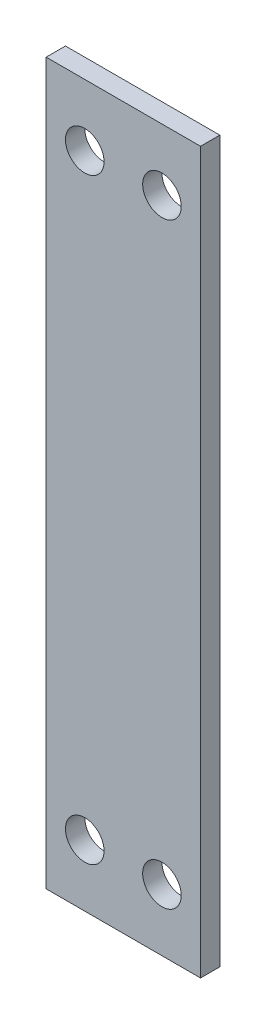
ISO-10303-21;
HEADER;
FILE_DESCRIPTION(('STEP AP214'),'2;1');
FILE_NAME('part.step','',(''),(''),'','','');
FILE_SCHEMA(('AUTOMOTIVE_DESIGN { 1 0 10303 214 1 1 1 1 }'));
ENDSEC;
DATA;
#1=APPLICATION_CONTEXT('core data for automotive mechanical design processes');
#2=APPLICATION_PROTOCOL_DEFINITION('international standard','automotive_design',2000,#1);
#3=PRODUCT_CONTEXT('',#1,'mechanical');
#4=PRODUCT('Part','Part','',(#3));
#5=PRODUCT_RELATED_PRODUCT_CATEGORY('part','',(#4));
#6=PRODUCT_DEFINITION_FORMATION('','',#4);
#7=PRODUCT_DEFINITION_CONTEXT('part definition',#1,'design');
#8=PRODUCT_DEFINITION('design','',#6,#7);
#9=PRODUCT_DEFINITION_SHAPE('','',#8);
#10=(LENGTH_UNIT() NAMED_UNIT(*) SI_UNIT(.MILLI.,.METRE.));
#11=(NAMED_UNIT(*) PLANE_ANGLE_UNIT() SI_UNIT($,.RADIAN.));
#12=(NAMED_UNIT(*) SI_UNIT($,.STERADIAN.) SOLID_ANGLE_UNIT());
#13=UNCERTAINTY_MEASURE_WITH_UNIT(LENGTH_MEASURE(1.E-05),#10,'distance_accuracy_value','');
#14=(GEOMETRIC_REPRESENTATION_CONTEXT(3) GLOBAL_UNCERTAINTY_ASSIGNED_CONTEXT((#13)) GLOBAL_UNIT_ASSIGNED_CONTEXT((#10,
#11,#12)) REPRESENTATION_CONTEXT('',''));
#15=CARTESIAN_POINT('',(0.,0.,0.));
#16=DIRECTION('',(0.,0.,1.));
#17=DIRECTION('',(1.,0.,0.));
#18=AXIS2_PLACEMENT_3D('',#15,#16,#17);
#19=CARTESIAN_POINT('',(0.,0.,4.7625));
#20=DIRECTION('',(0.,0.,-1.));
#21=DIRECTION('',(-1.,0.,0.));
#22=AXIS2_PLACEMENT_3D('',#19,#20,#21);
#23=PLANE('',#22);
#24=DIRECTION('',(0.,-1.,0.));
#25=VECTOR('',#24,1.);
#26=CARTESIAN_POINT('',(0.,0.,4.7625));
#27=LINE('',#26,#25);
#28=CARTESIAN_POINT('',(0.,177.8,4.7625));
#29=VERTEX_POINT('',#28);
#30=CARTESIAN_POINT('',(0.,0.,4.7625));
#31=VERTEX_POINT('',#30);
#32=EDGE_CURVE('E96',#29,#31,#27,.T.);
#33=ORIENTED_EDGE('',*,*,#32,.T.);
#34=DIRECTION('',(1.,0.,0.));
#35=VECTOR('',#34,1.);
#36=CARTESIAN_POINT('',(0.,0.,4.7625));
#37=LINE('',#36,#35);
#38=CARTESIAN_POINT('',(38.1,0.,4.7625));
#39=VERTEX_POINT('',#38);
#40=EDGE_CURVE('E91',#31,#39,#37,.T.);
#41=ORIENTED_EDGE('',*,*,#40,.T.);
#42=DIRECTION('',(0.,1.,0.));
#43=VECTOR('',#42,1.);
#44=CARTESIAN_POINT('',(38.1,0.,4.7625));
#45=LINE('',#44,#43);
#46=CARTESIAN_POINT('',(38.1,177.8,4.7625));
#47=VERTEX_POINT('',#46);
#48=EDGE_CURVE('E94',#39,#47,#45,.T.);
#49=ORIENTED_EDGE('',*,*,#48,.T.);
#50=DIRECTION('',(-1.,0.,0.));
#51=VECTOR('',#50,1.);
#52=CARTESIAN_POINT('',(0.,177.8,4.7625));
#53=LINE('',#52,#51);
#54=EDGE_CURVE('E61',#47,#29,#53,.T.);
#55=ORIENTED_EDGE('',*,*,#54,.T.);
#56=EDGE_LOOP('',(#33,#41,#49,#55));
#57=FACE_BOUND('',#56,.T.);
#58=CARTESIAN_POINT('',(9.525,15.24,4.7625));
#59=DIRECTION('',(0.,0.,1.));
#60=DIRECTION('',(1.,0.,0.));
#61=AXIS2_PLACEMENT_3D('',#58,#59,#60);
#62=CIRCLE('',#61,4.7625);
#63=CARTESIAN_POINT('',(4.7625,15.24,4.7625));
#64=VERTEX_POINT('',#63);
#65=EDGE_CURVE('E116',#64,#64,#62,.T.);
#66=ORIENTED_EDGE('',*,*,#65,.F.);
#67=EDGE_LOOP('',(#66));
#68=FACE_BOUND('',#67,.T.);
#69=CARTESIAN_POINT('',(28.575,15.24,4.7625));
#70=DIRECTION('',(0.,0.,1.));
#71=DIRECTION('',(1.,0.,0.));
#72=AXIS2_PLACEMENT_3D('',#69,#70,#71);
#73=CIRCLE('',#72,4.7625);
#74=CARTESIAN_POINT('',(23.8125,15.24,4.7625));
#75=VERTEX_POINT('',#74);
#76=EDGE_CURVE('E138',#75,#75,#73,.T.);
#77=ORIENTED_EDGE('',*,*,#76,.F.);
#78=EDGE_LOOP('',(#77));
#79=FACE_BOUND('',#78,.T.);
#80=CARTESIAN_POINT('',(9.525,162.56,4.7625));
#81=DIRECTION('',(0.,0.,1.));
#82=DIRECTION('',(1.,0.,0.));
#83=AXIS2_PLACEMENT_3D('',#80,#81,#82);
#84=CIRCLE('',#83,4.7625);
#85=CARTESIAN_POINT('',(4.76250000000001,162.56,4.7625));
#86=VERTEX_POINT('',#85);
#87=EDGE_CURVE('E146',#86,#86,#84,.T.);
#88=ORIENTED_EDGE('',*,*,#87,.F.);
#89=EDGE_LOOP('',(#88));
#90=FACE_BOUND('',#89,.T.);
#91=CARTESIAN_POINT('',(28.575,162.56,4.7625));
#92=DIRECTION('',(0.,0.,1.));
#93=DIRECTION('',(1.,0.,0.));
#94=AXIS2_PLACEMENT_3D('',#91,#92,#93);
#95=CIRCLE('',#94,4.7625);
#96=CARTESIAN_POINT('',(23.8125,162.56,4.7625));
#97=VERTEX_POINT('',#96);
#98=EDGE_CURVE('E154',#97,#97,#95,.T.);
#99=ORIENTED_EDGE('',*,*,#98,.F.);
#100=EDGE_LOOP('',(#99));
#101=FACE_BOUND('',#100,.T.);
#102=ADVANCED_FACE('F43',(#57,#68,#79,#90,#101),#23,.F.);
#103=CARTESIAN_POINT('',(0.,0.,0.));
#104=DIRECTION('',(0.,0.,-1.));
#105=DIRECTION('',(-1.,0.,0.));
#106=AXIS2_PLACEMENT_3D('',#103,#104,#105);
#107=PLANE('',#106);
#108=CARTESIAN_POINT('',(9.525,162.56,0.));
#109=DIRECTION('',(0.,0.,1.));
#110=DIRECTION('',(1.,0.,0.));
#111=AXIS2_PLACEMENT_3D('',#108,#109,#110);
#112=CIRCLE('',#111,4.7625);
#113=CARTESIAN_POINT('',(4.76250000000001,162.56,0.));
#114=VERTEX_POINT('',#113);
#115=EDGE_CURVE('E150',#114,#114,#112,.T.);
#116=ORIENTED_EDGE('',*,*,#115,.T.);
#117=EDGE_LOOP('',(#116));
#118=FACE_BOUND('',#117,.T.);
#119=CARTESIAN_POINT('',(9.525,15.24,0.));
#120=DIRECTION('',(0.,0.,1.));
#121=DIRECTION('',(1.,0.,0.));
#122=AXIS2_PLACEMENT_3D('',#119,#120,#121);
#123=CIRCLE('',#122,4.7625);
#124=CARTESIAN_POINT('',(4.7625,15.24,0.));
#125=VERTEX_POINT('',#124);
#126=EDGE_CURVE('E134',#125,#125,#123,.T.);
#127=ORIENTED_EDGE('',*,*,#126,.T.);
#128=EDGE_LOOP('',(#127));
#129=FACE_BOUND('',#128,.T.);
#130=DIRECTION('',(0.,-1.,0.));
#131=VECTOR('',#130,1.);
#132=CARTESIAN_POINT('',(0.,0.,0.));
#133=LINE('',#132,#131);
#134=CARTESIAN_POINT('',(0.,177.8,0.));
#135=VERTEX_POINT('',#134);
#136=CARTESIAN_POINT('',(0.,0.,0.));
#137=VERTEX_POINT('',#136);
#138=EDGE_CURVE('E112',#135,#137,#133,.T.);
#139=ORIENTED_EDGE('',*,*,#138,.F.);
#140=DIRECTION('',(-1.,0.,0.));
#141=VECTOR('',#140,1.);
#142=CARTESIAN_POINT('',(0.,177.8,0.));
#143=LINE('',#142,#141);
#144=CARTESIAN_POINT('',(38.1,177.8,0.));
#145=VERTEX_POINT('',#144);
#146=EDGE_CURVE('E84',#145,#135,#143,.T.);
#147=ORIENTED_EDGE('',*,*,#146,.F.);
#148=DIRECTION('',(0.,1.,0.));
#149=VECTOR('',#148,1.);
#150=CARTESIAN_POINT('',(38.1,0.,0.));
#151=LINE('',#150,#149);
#152=CARTESIAN_POINT('',(38.1,0.,0.));
#153=VERTEX_POINT('',#152);
#154=EDGE_CURVE('E78',#153,#145,#151,.T.);
#155=ORIENTED_EDGE('',*,*,#154,.F.);
#156=DIRECTION('',(1.,0.,0.));
#157=VECTOR('',#156,1.);
#158=CARTESIAN_POINT('',(0.,0.,0.));
#159=LINE('',#158,#157);
#160=EDGE_CURVE('E101',#137,#153,#159,.T.);
#161=ORIENTED_EDGE('',*,*,#160,.F.);
#162=EDGE_LOOP('',(#139,#147,#155,#161));
#163=FACE_BOUND('',#162,.T.);
#164=CARTESIAN_POINT('',(28.575,15.24,0.));
#165=DIRECTION('',(0.,0.,1.));
#166=DIRECTION('',(1.,0.,0.));
#167=AXIS2_PLACEMENT_3D('',#164,#165,#166);
#168=CIRCLE('',#167,4.7625);
#169=CARTESIAN_POINT('',(23.8125,15.24,0.));
#170=VERTEX_POINT('',#169);
#171=EDGE_CURVE('E142',#170,#170,#168,.T.);
#172=ORIENTED_EDGE('',*,*,#171,.T.);
#173=EDGE_LOOP('',(#172));
#174=FACE_BOUND('',#173,.T.);
#175=CARTESIAN_POINT('',(28.575,162.56,0.));
#176=DIRECTION('',(0.,0.,1.));
#177=DIRECTION('',(1.,0.,0.));
#178=AXIS2_PLACEMENT_3D('',#175,#176,#177);
#179=CIRCLE('',#178,4.7625);
#180=CARTESIAN_POINT('',(23.8125,162.56,0.));
#181=VERTEX_POINT('',#180);
#182=EDGE_CURVE('E158',#181,#181,#179,.T.);
#183=ORIENTED_EDGE('',*,*,#182,.T.);
#184=EDGE_LOOP('',(#183));
#185=FACE_BOUND('',#184,.T.);
#186=ADVANCED_FACE('F129',(#118,#129,#163,#174,#185),#107,.T.);
#187=CARTESIAN_POINT('',(0.,0.,4.7625));
#188=DIRECTION('',(1.,0.,0.));
#189=DIRECTION('',(0.,0.,-1.));
#190=AXIS2_PLACEMENT_3D('',#187,#188,#189);
#191=PLANE('',#190);
#192=ORIENTED_EDGE('',*,*,#138,.T.);
#193=DIRECTION('',(0.,0.,-1.));
#194=VECTOR('',#193,1.);
#195=CARTESIAN_POINT('',(0.,0.,4.7625));
#196=LINE('',#195,#194);
#197=EDGE_CURVE('E11',#31,#137,#196,.T.);
#198=ORIENTED_EDGE('',*,*,#197,.F.);
#199=ORIENTED_EDGE('',*,*,#32,.F.);
#200=DIRECTION('',(0.,0.,-1.));
#201=VECTOR('',#200,1.);
#202=CARTESIAN_POINT('',(0.,177.8,4.7625));
#203=LINE('',#202,#201);
#204=EDGE_CURVE('E108',#29,#135,#203,.T.);
#205=ORIENTED_EDGE('',*,*,#204,.T.);
#206=EDGE_LOOP('',(#192,#198,#199,#205));
#207=FACE_BOUND('',#206,.T.);
#208=ADVANCED_FACE('F45',(#207),#191,.F.);
#209=CARTESIAN_POINT('',(0.,0.,4.7625));
#210=DIRECTION('',(0.,1.,0.));
#211=DIRECTION('',(0.,0.,1.));
#212=AXIS2_PLACEMENT_3D('',#209,#210,#211);
#213=PLANE('',#212);
#214=ORIENTED_EDGE('',*,*,#160,.T.);
#215=DIRECTION('',(0.,0.,-1.));
#216=VECTOR('',#215,1.);
#217=CARTESIAN_POINT('',(38.1,0.,4.7625));
#218=LINE('',#217,#216);
#219=EDGE_CURVE('E53',#39,#153,#218,.T.);
#220=ORIENTED_EDGE('',*,*,#219,.F.);
#221=ORIENTED_EDGE('',*,*,#40,.F.);
#222=ORIENTED_EDGE('',*,*,#197,.T.);
#223=EDGE_LOOP('',(#214,#220,#221,#222));
#224=FACE_BOUND('',#223,.T.);
#225=ADVANCED_FACE('F100',(#224),#213,.F.);
#226=CARTESIAN_POINT('',(38.1,0.,4.7625));
#227=DIRECTION('',(-1.,0.,0.));
#228=DIRECTION('',(0.,0.,1.));
#229=AXIS2_PLACEMENT_3D('',#226,#227,#228);
#230=PLANE('',#229);
#231=ORIENTED_EDGE('',*,*,#154,.T.);
#232=DIRECTION('',(0.,0.,-1.));
#233=VECTOR('',#232,1.);
#234=CARTESIAN_POINT('',(38.1,177.8,4.7625));
#235=LINE('',#234,#233);
#236=EDGE_CURVE('E103',#47,#145,#235,.T.);
#237=ORIENTED_EDGE('',*,*,#236,.F.);
#238=ORIENTED_EDGE('',*,*,#48,.F.);
#239=ORIENTED_EDGE('',*,*,#219,.T.);
#240=EDGE_LOOP('',(#231,#237,#238,#239));
#241=FACE_BOUND('',#240,.T.);
#242=ADVANCED_FACE('F104',(#241),#230,.F.);
#243=CARTESIAN_POINT('',(0.,177.8,4.7625));
#244=DIRECTION('',(0.,-1.,0.));
#245=DIRECTION('',(0.,0.,-1.));
#246=AXIS2_PLACEMENT_3D('',#243,#244,#245);
#247=PLANE('',#246);
#248=ORIENTED_EDGE('',*,*,#146,.T.);
#249=ORIENTED_EDGE('',*,*,#204,.F.);
#250=ORIENTED_EDGE('',*,*,#54,.F.);
#251=ORIENTED_EDGE('',*,*,#236,.T.);
#252=EDGE_LOOP('',(#248,#249,#250,#251));
#253=FACE_BOUND('',#252,.T.);
#254=ADVANCED_FACE('F126',(#253),#247,.F.);
#255=CARTESIAN_POINT('',(9.525,15.24,4.7625));
#256=DIRECTION('',(0.,0.,-1.));
#257=DIRECTION('',(-1.,0.,0.));
#258=AXIS2_PLACEMENT_3D('',#255,#256,#257);
#259=CYLINDRICAL_SURFACE('',#258,4.7625);
#260=CARTESIAN_POINT('',(4.7625,15.24,4.7625));
#261=CARTESIAN_POINT('',(4.7625,15.24,4.712890625));
#262=CARTESIAN_POINT('',(4.7625,15.24,4.66328125));
#263=CARTESIAN_POINT('',(4.7625,15.24,4.5640625));
#264=CARTESIAN_POINT('',(4.7625,15.24,4.514453125));
#265=CARTESIAN_POINT('',(4.7625,15.24,4.415234375));
#266=CARTESIAN_POINT('',(4.7625,15.24,4.365625));
#267=CARTESIAN_POINT('',(4.7625,15.24,4.26640625));
#268=CARTESIAN_POINT('',(4.7625,15.24,4.216796875));
#269=CARTESIAN_POINT('',(4.7625,15.24,4.117578125));
#270=CARTESIAN_POINT('',(4.7625,15.24,4.06796875));
#271=CARTESIAN_POINT('',(4.7625,15.24,3.96875));
#272=CARTESIAN_POINT('',(4.7625,15.24,3.919140625));
#273=CARTESIAN_POINT('',(4.7625,15.24,3.819921875));
#274=CARTESIAN_POINT('',(4.7625,15.24,3.7703125));
#275=CARTESIAN_POINT('',(4.7625,15.24,3.67109375));
#276=CARTESIAN_POINT('',(4.7625,15.24,3.621484375));
#277=CARTESIAN_POINT('',(4.7625,15.24,3.522265625));
#278=CARTESIAN_POINT('',(4.7625,15.24,3.47265625));
#279=CARTESIAN_POINT('',(4.7625,15.24,3.3734375));
#280=CARTESIAN_POINT('',(4.7625,15.24,3.323828125));
#281=CARTESIAN_POINT('',(4.7625,15.24,3.224609375));
#282=CARTESIAN_POINT('',(4.7625,15.24,3.175));
#283=CARTESIAN_POINT('',(4.7625,15.24,3.07578125));
#284=CARTESIAN_POINT('',(4.7625,15.24,3.026171875));
#285=CARTESIAN_POINT('',(4.7625,15.24,2.926953125));
#286=CARTESIAN_POINT('',(4.7625,15.24,2.87734375));
#287=CARTESIAN_POINT('',(4.7625,15.24,2.778125));
#288=CARTESIAN_POINT('',(4.7625,15.24,2.728515625));
#289=CARTESIAN_POINT('',(4.7625,15.24,2.629296875));
#290=CARTESIAN_POINT('',(4.7625,15.24,2.5796875));
#291=CARTESIAN_POINT('',(4.7625,15.24,2.48046875));
#292=CARTESIAN_POINT('',(4.7625,15.24,2.430859375));
#293=CARTESIAN_POINT('',(4.7625,15.24,2.331640625));
#294=CARTESIAN_POINT('',(4.7625,15.24,2.28203125));
#295=CARTESIAN_POINT('',(4.7625,15.24,2.1828125));
#296=CARTESIAN_POINT('',(4.7625,15.24,2.133203125));
#297=CARTESIAN_POINT('',(4.7625,15.24,2.033984375));
#298=CARTESIAN_POINT('',(4.7625,15.24,1.984375));
#299=CARTESIAN_POINT('',(4.7625,15.24,1.88515625));
#300=CARTESIAN_POINT('',(4.7625,15.24,1.835546875));
#301=CARTESIAN_POINT('',(4.7625,15.24,1.736328125));
#302=CARTESIAN_POINT('',(4.7625,15.24,1.68671875));
#303=CARTESIAN_POINT('',(4.7625,15.24,1.5875));
#304=CARTESIAN_POINT('',(4.7625,15.24,1.537890625));
#305=CARTESIAN_POINT('',(4.7625,15.24,1.438671875));
#306=CARTESIAN_POINT('',(4.7625,15.24,1.3890625));
#307=CARTESIAN_POINT('',(4.7625,15.24,1.28984375));
#308=CARTESIAN_POINT('',(4.7625,15.24,1.240234375));
#309=CARTESIAN_POINT('',(4.7625,15.24,1.141015625));
#310=CARTESIAN_POINT('',(4.7625,15.24,1.09140625));
#311=CARTESIAN_POINT('',(4.7625,15.24,0.992187499999999));
#312=CARTESIAN_POINT('',(4.7625,15.24,0.942578124999999));
#313=CARTESIAN_POINT('',(4.7625,15.24,0.843359375));
#314=CARTESIAN_POINT('',(4.7625,15.24,0.79375));
#315=CARTESIAN_POINT('',(4.7625,15.24,0.69453125));
#316=CARTESIAN_POINT('',(4.7625,15.24,0.644921875));
#317=CARTESIAN_POINT('',(4.7625,15.24,0.545703125));
#318=CARTESIAN_POINT('',(4.7625,15.24,0.49609375));
#319=CARTESIAN_POINT('',(4.7625,15.24,0.396875));
#320=CARTESIAN_POINT('',(4.7625,15.24,0.347265625));
#321=CARTESIAN_POINT('',(4.7625,15.24,0.248046875));
#322=CARTESIAN_POINT('',(4.7625,15.24,0.1984375));
#323=CARTESIAN_POINT('',(4.7625,15.24,0.09921875));
#324=CARTESIAN_POINT('',(4.7625,15.24,0.049609375));
#325=CARTESIAN_POINT('',(4.7625,15.24,0.));
#326=B_SPLINE_CURVE_WITH_KNOTS('',3,(#260,#261,#262,#263,#264,#265,#266,#267,#268,#269,#270,
#271,#272,#273,#274,#275,#276,#277,#278,#279,#280,#281,#282,#283,#284,#285,#286,#287,#288,#289,
#290,#291,#292,#293,#294,#295,#296,#297,#298,#299,#300,#301,#302,#303,#304,#305,#306,#307,#308,
#309,#310,#311,#312,#313,#314,#315,#316,#317,#318,#319,#320,#321,#322,#323,#324,#325),
.UNSPECIFIED.,.F.,.F.,(4,2,2,2,2,2,2,2,2,2,2,2,2,2,2,2,2,2,2,2,2,2,2,2,2,2,2,2,2,2,2,2,4),(0.,
0.148828125,0.29765625,0.446484375,0.5953125,0.744140625,0.892968750000001,1.041796875,1.190625,
1.339453125,1.48828125,1.637109375,1.7859375,1.934765625,2.08359375,2.232421875,2.38125,
2.530078125,2.67890625,2.827734375,2.9765625,3.125390625,3.27421875,3.423046875,3.571875,
3.720703125,3.86953125,4.018359375,4.1671875,4.316015625,4.46484375,4.613671875,4.7625),.UNSPECIFIED.);
#327=EDGE_CURVE('BSEAM177',#64,#125,#326,.T.);
#328=ORIENTED_EDGE('',*,*,#65,.T.);
#329=ORIENTED_EDGE('',*,*,#126,.F.);
#330=ORIENTED_EDGE('',*,*,#327,.T.);
#331=ORIENTED_EDGE('',*,*,#327,.F.);
#332=EDGE_LOOP('',(#328,#330,#329,#331));
#333=FACE_BOUND('',#332,.T.);
#334=ADVANCED_FACE('F177',(#333),#259,.F.);
#335=CARTESIAN_POINT('',(28.575,15.24,4.7625));
#336=DIRECTION('',(0.,0.,-1.));
#337=DIRECTION('',(-1.,0.,0.));
#338=AXIS2_PLACEMENT_3D('',#335,#336,#337);
#339=CYLINDRICAL_SURFACE('',#338,4.7625);
#340=CARTESIAN_POINT('',(23.8125,15.24,4.7625));
#341=CARTESIAN_POINT('',(23.8125,15.24,4.712890625));
#342=CARTESIAN_POINT('',(23.8125,15.24,4.66328125));
#343=CARTESIAN_POINT('',(23.8125,15.24,4.5640625));
#344=CARTESIAN_POINT('',(23.8125,15.24,4.514453125));
#345=CARTESIAN_POINT('',(23.8125,15.24,4.415234375));
#346=CARTESIAN_POINT('',(23.8125,15.24,4.365625));
#347=CARTESIAN_POINT('',(23.8125,15.24,4.26640625));
#348=CARTESIAN_POINT('',(23.8125,15.24,4.216796875));
#349=CARTESIAN_POINT('',(23.8125,15.24,4.117578125));
#350=CARTESIAN_POINT('',(23.8125,15.24,4.06796875));
#351=CARTESIAN_POINT('',(23.8125,15.24,3.96875));
#352=CARTESIAN_POINT('',(23.8125,15.24,3.919140625));
#353=CARTESIAN_POINT('',(23.8125,15.24,3.819921875));
#354=CARTESIAN_POINT('',(23.8125,15.24,3.7703125));
#355=CARTESIAN_POINT('',(23.8125,15.24,3.67109375));
#356=CARTESIAN_POINT('',(23.8125,15.24,3.621484375));
#357=CARTESIAN_POINT('',(23.8125,15.24,3.522265625));
#358=CARTESIAN_POINT('',(23.8125,15.24,3.47265625));
#359=CARTESIAN_POINT('',(23.8125,15.24,3.3734375));
#360=CARTESIAN_POINT('',(23.8125,15.24,3.323828125));
#361=CARTESIAN_POINT('',(23.8125,15.24,3.224609375));
#362=CARTESIAN_POINT('',(23.8125,15.24,3.175));
#363=CARTESIAN_POINT('',(23.8125,15.24,3.07578125));
#364=CARTESIAN_POINT('',(23.8125,15.24,3.026171875));
#365=CARTESIAN_POINT('',(23.8125,15.24,2.926953125));
#366=CARTESIAN_POINT('',(23.8125,15.24,2.87734375));
#367=CARTESIAN_POINT('',(23.8125,15.24,2.778125));
#368=CARTESIAN_POINT('',(23.8125,15.24,2.728515625));
#369=CARTESIAN_POINT('',(23.8125,15.24,2.629296875));
#370=CARTESIAN_POINT('',(23.8125,15.24,2.5796875));
#371=CARTESIAN_POINT('',(23.8125,15.24,2.48046875));
#372=CARTESIAN_POINT('',(23.8125,15.24,2.430859375));
#373=CARTESIAN_POINT('',(23.8125,15.24,2.331640625));
#374=CARTESIAN_POINT('',(23.8125,15.24,2.28203125));
#375=CARTESIAN_POINT('',(23.8125,15.24,2.1828125));
#376=CARTESIAN_POINT('',(23.8125,15.24,2.133203125));
#377=CARTESIAN_POINT('',(23.8125,15.24,2.033984375));
#378=CARTESIAN_POINT('',(23.8125,15.24,1.984375));
#379=CARTESIAN_POINT('',(23.8125,15.24,1.88515625));
#380=CARTESIAN_POINT('',(23.8125,15.24,1.835546875));
#381=CARTESIAN_POINT('',(23.8125,15.24,1.736328125));
#382=CARTESIAN_POINT('',(23.8125,15.24,1.68671875));
#383=CARTESIAN_POINT('',(23.8125,15.24,1.5875));
#384=CARTESIAN_POINT('',(23.8125,15.24,1.537890625));
#385=CARTESIAN_POINT('',(23.8125,15.24,1.438671875));
#386=CARTESIAN_POINT('',(23.8125,15.24,1.3890625));
#387=CARTESIAN_POINT('',(23.8125,15.24,1.28984375));
#388=CARTESIAN_POINT('',(23.8125,15.24,1.240234375));
#389=CARTESIAN_POINT('',(23.8125,15.24,1.141015625));
#390=CARTESIAN_POINT('',(23.8125,15.24,1.09140625));
#391=CARTESIAN_POINT('',(23.8125,15.24,0.992187499999999));
#392=CARTESIAN_POINT('',(23.8125,15.24,0.942578124999999));
#393=CARTESIAN_POINT('',(23.8125,15.24,0.843359375));
#394=CARTESIAN_POINT('',(23.8125,15.24,0.79375));
#395=CARTESIAN_POINT('',(23.8125,15.24,0.69453125));
#396=CARTESIAN_POINT('',(23.8125,15.24,0.644921875));
#397=CARTESIAN_POINT('',(23.8125,15.24,0.545703125));
#398=CARTESIAN_POINT('',(23.8125,15.24,0.49609375));
#399=CARTESIAN_POINT('',(23.8125,15.24,0.396875));
#400=CARTESIAN_POINT('',(23.8125,15.24,0.347265625));
#401=CARTESIAN_POINT('',(23.8125,15.24,0.248046875));
#402=CARTESIAN_POINT('',(23.8125,15.24,0.1984375));
#403=CARTESIAN_POINT('',(23.8125,15.24,0.09921875));
#404=CARTESIAN_POINT('',(23.8125,15.24,0.049609375));
#405=CARTESIAN_POINT('',(23.8125,15.24,0.));
#406=B_SPLINE_CURVE_WITH_KNOTS('',3,(#340,#341,#342,#343,#344,#345,#346,#347,#348,#349,#350,
#351,#352,#353,#354,#355,#356,#357,#358,#359,#360,#361,#362,#363,#364,#365,#366,#367,#368,#369,
#370,#371,#372,#373,#374,#375,#376,#377,#378,#379,#380,#381,#382,#383,#384,#385,#386,#387,#388,
#389,#390,#391,#392,#393,#394,#395,#396,#397,#398,#399,#400,#401,#402,#403,#404,#405),
.UNSPECIFIED.,.F.,.F.,(4,2,2,2,2,2,2,2,2,2,2,2,2,2,2,2,2,2,2,2,2,2,2,2,2,2,2,2,2,2,2,2,4),(0.,
0.148828125,0.29765625,0.446484375,0.5953125,0.744140625,0.892968750000001,1.041796875,1.190625,
1.339453125,1.48828125,1.637109375,1.7859375,1.934765625,2.08359375,2.232421875,2.38125,
2.530078125,2.67890625,2.827734375,2.9765625,3.125390625,3.27421875,3.423046875,3.571875,
3.720703125,3.86953125,4.018359375,4.1671875,4.316015625,4.46484375,4.613671875,4.7625),.UNSPECIFIED.);
#407=EDGE_CURVE('BSEAM231',#75,#170,#406,.T.);
#408=ORIENTED_EDGE('',*,*,#76,.T.);
#409=ORIENTED_EDGE('',*,*,#171,.F.);
#410=ORIENTED_EDGE('',*,*,#407,.T.);
#411=ORIENTED_EDGE('',*,*,#407,.F.);
#412=EDGE_LOOP('',(#408,#410,#409,#411));
#413=FACE_BOUND('',#412,.T.);
#414=ADVANCED_FACE('F231',(#413),#339,.F.);
#415=CARTESIAN_POINT('',(9.525,162.56,4.7625));
#416=DIRECTION('',(0.,0.,-1.));
#417=DIRECTION('',(-1.,0.,0.));
#418=AXIS2_PLACEMENT_3D('',#415,#416,#417);
#419=CYLINDRICAL_SURFACE('',#418,4.7625);
#420=CARTESIAN_POINT('',(4.76250000000001,162.56,4.7625));
#421=CARTESIAN_POINT('',(4.76250000000001,162.56,4.712890625));
#422=CARTESIAN_POINT('',(4.76250000000001,162.56,4.66328125));
#423=CARTESIAN_POINT('',(4.76250000000001,162.56,4.5640625));
#424=CARTESIAN_POINT('',(4.76250000000001,162.56,4.514453125));
#425=CARTESIAN_POINT('',(4.76250000000001,162.56,4.415234375));
#426=CARTESIAN_POINT('',(4.76250000000001,162.56,4.365625));
#427=CARTESIAN_POINT('',(4.76250000000001,162.56,4.26640625));
#428=CARTESIAN_POINT('',(4.76250000000001,162.56,4.216796875));
#429=CARTESIAN_POINT('',(4.76250000000001,162.56,4.117578125));
#430=CARTESIAN_POINT('',(4.76250000000001,162.56,4.06796875));
#431=CARTESIAN_POINT('',(4.76250000000001,162.56,3.96875));
#432=CARTESIAN_POINT('',(4.76250000000001,162.56,3.919140625));
#433=CARTESIAN_POINT('',(4.76250000000001,162.56,3.819921875));
#434=CARTESIAN_POINT('',(4.76250000000001,162.56,3.7703125));
#435=CARTESIAN_POINT('',(4.76250000000001,162.56,3.67109375));
#436=CARTESIAN_POINT('',(4.76250000000001,162.56,3.621484375));
#437=CARTESIAN_POINT('',(4.76250000000001,162.56,3.522265625));
#438=CARTESIAN_POINT('',(4.76250000000001,162.56,3.47265625));
#439=CARTESIAN_POINT('',(4.76250000000001,162.56,3.3734375));
#440=CARTESIAN_POINT('',(4.76250000000001,162.56,3.323828125));
#441=CARTESIAN_POINT('',(4.76250000000001,162.56,3.224609375));
#442=CARTESIAN_POINT('',(4.76250000000001,162.56,3.175));
#443=CARTESIAN_POINT('',(4.76250000000001,162.56,3.07578125));
#444=CARTESIAN_POINT('',(4.76250000000001,162.56,3.026171875));
#445=CARTESIAN_POINT('',(4.76250000000001,162.56,2.926953125));
#446=CARTESIAN_POINT('',(4.76250000000001,162.56,2.87734375));
#447=CARTESIAN_POINT('',(4.76250000000001,162.56,2.778125));
#448=CARTESIAN_POINT('',(4.76250000000001,162.56,2.728515625));
#449=CARTESIAN_POINT('',(4.76250000000001,162.56,2.629296875));
#450=CARTESIAN_POINT('',(4.76250000000001,162.56,2.5796875));
#451=CARTESIAN_POINT('',(4.76250000000001,162.56,2.48046875));
#452=CARTESIAN_POINT('',(4.76250000000001,162.56,2.430859375));
#453=CARTESIAN_POINT('',(4.76250000000001,162.56,2.331640625));
#454=CARTESIAN_POINT('',(4.76250000000001,162.56,2.28203125));
#455=CARTESIAN_POINT('',(4.76250000000001,162.56,2.1828125));
#456=CARTESIAN_POINT('',(4.76250000000001,162.56,2.133203125));
#457=CARTESIAN_POINT('',(4.76250000000001,162.56,2.033984375));
#458=CARTESIAN_POINT('',(4.76250000000001,162.56,1.984375));
#459=CARTESIAN_POINT('',(4.76250000000001,162.56,1.88515625));
#460=CARTESIAN_POINT('',(4.76250000000001,162.56,1.835546875));
#461=CARTESIAN_POINT('',(4.76250000000001,162.56,1.736328125));
#462=CARTESIAN_POINT('',(4.76250000000001,162.56,1.68671875));
#463=CARTESIAN_POINT('',(4.76250000000001,162.56,1.5875));
#464=CARTESIAN_POINT('',(4.76250000000001,162.56,1.537890625));
#465=CARTESIAN_POINT('',(4.76250000000001,162.56,1.438671875));
#466=CARTESIAN_POINT('',(4.76250000000001,162.56,1.3890625));
#467=CARTESIAN_POINT('',(4.76250000000001,162.56,1.28984375));
#468=CARTESIAN_POINT('',(4.76250000000001,162.56,1.240234375));
#469=CARTESIAN_POINT('',(4.76250000000001,162.56,1.141015625));
#470=CARTESIAN_POINT('',(4.76250000000001,162.56,1.09140625));
#471=CARTESIAN_POINT('',(4.76250000000001,162.56,0.992187499999999));
#472=CARTESIAN_POINT('',(4.76250000000001,162.56,0.942578124999999));
#473=CARTESIAN_POINT('',(4.76250000000001,162.56,0.843359375));
#474=CARTESIAN_POINT('',(4.76250000000001,162.56,0.79375));
#475=CARTESIAN_POINT('',(4.76250000000001,162.56,0.69453125));
#476=CARTESIAN_POINT('',(4.76250000000001,162.56,0.644921875));
#477=CARTESIAN_POINT('',(4.76250000000001,162.56,0.545703125));
#478=CARTESIAN_POINT('',(4.76250000000001,162.56,0.49609375));
#479=CARTESIAN_POINT('',(4.76250000000001,162.56,0.396875));
#480=CARTESIAN_POINT('',(4.76250000000001,162.56,0.347265625));
#481=CARTESIAN_POINT('',(4.76250000000001,162.56,0.248046875));
#482=CARTESIAN_POINT('',(4.76250000000001,162.56,0.1984375));
#483=CARTESIAN_POINT('',(4.76250000000001,162.56,0.09921875));
#484=CARTESIAN_POINT('',(4.76250000000001,162.56,0.049609375));
#485=CARTESIAN_POINT('',(4.76250000000001,162.56,0.));
#486=B_SPLINE_CURVE_WITH_KNOTS('',3,(#420,#421,#422,#423,#424,#425,#426,#427,#428,#429,#430,
#431,#432,#433,#434,#435,#436,#437,#438,#439,#440,#441,#442,#443,#444,#445,#446,#447,#448,#449,
#450,#451,#452,#453,#454,#455,#456,#457,#458,#459,#460,#461,#462,#463,#464,#465,#466,#467,#468,
#469,#470,#471,#472,#473,#474,#475,#476,#477,#478,#479,#480,#481,#482,#483,#484,#485),
.UNSPECIFIED.,.F.,.F.,(4,2,2,2,2,2,2,2,2,2,2,2,2,2,2,2,2,2,2,2,2,2,2,2,2,2,2,2,2,2,2,2,4),(0.,
0.148828125,0.29765625,0.446484375,0.5953125,0.744140625,0.892968750000001,1.041796875,1.190625,
1.339453125,1.48828125,1.637109375,1.7859375,1.934765625,2.08359375,2.232421875,2.38125,
2.530078125,2.67890625,2.827734375,2.9765625,3.125390625,3.27421875,3.423046875,3.571875,
3.720703125,3.86953125,4.018359375,4.1671875,4.316015625,4.46484375,4.613671875,4.7625),.UNSPECIFIED.);
#487=EDGE_CURVE('BSEAM240',#86,#114,#486,.T.);
#488=ORIENTED_EDGE('',*,*,#87,.T.);
#489=ORIENTED_EDGE('',*,*,#115,.F.);
#490=ORIENTED_EDGE('',*,*,#487,.T.);
#491=ORIENTED_EDGE('',*,*,#487,.F.);
#492=EDGE_LOOP('',(#488,#490,#489,#491));
#493=FACE_BOUND('',#492,.T.);
#494=ADVANCED_FACE('F240',(#493),#419,.F.);
#495=CARTESIAN_POINT('',(28.575,162.56,4.7625));
#496=DIRECTION('',(0.,0.,-1.));
#497=DIRECTION('',(-1.,0.,0.));
#498=AXIS2_PLACEMENT_3D('',#495,#496,#497);
#499=CYLINDRICAL_SURFACE('',#498,4.7625);
#500=CARTESIAN_POINT('',(23.8125,162.56,4.7625));
#501=CARTESIAN_POINT('',(23.8125,162.56,4.712890625));
#502=CARTESIAN_POINT('',(23.8125,162.56,4.66328125));
#503=CARTESIAN_POINT('',(23.8125,162.56,4.5640625));
#504=CARTESIAN_POINT('',(23.8125,162.56,4.514453125));
#505=CARTESIAN_POINT('',(23.8125,162.56,4.415234375));
#506=CARTESIAN_POINT('',(23.8125,162.56,4.365625));
#507=CARTESIAN_POINT('',(23.8125,162.56,4.26640625));
#508=CARTESIAN_POINT('',(23.8125,162.56,4.216796875));
#509=CARTESIAN_POINT('',(23.8125,162.56,4.117578125));
#510=CARTESIAN_POINT('',(23.8125,162.56,4.06796875));
#511=CARTESIAN_POINT('',(23.8125,162.56,3.96875));
#512=CARTESIAN_POINT('',(23.8125,162.56,3.919140625));
#513=CARTESIAN_POINT('',(23.8125,162.56,3.819921875));
#514=CARTESIAN_POINT('',(23.8125,162.56,3.7703125));
#515=CARTESIAN_POINT('',(23.8125,162.56,3.67109375));
#516=CARTESIAN_POINT('',(23.8125,162.56,3.621484375));
#517=CARTESIAN_POINT('',(23.8125,162.56,3.522265625));
#518=CARTESIAN_POINT('',(23.8125,162.56,3.47265625));
#519=CARTESIAN_POINT('',(23.8125,162.56,3.3734375));
#520=CARTESIAN_POINT('',(23.8125,162.56,3.323828125));
#521=CARTESIAN_POINT('',(23.8125,162.56,3.224609375));
#522=CARTESIAN_POINT('',(23.8125,162.56,3.175));
#523=CARTESIAN_POINT('',(23.8125,162.56,3.07578125));
#524=CARTESIAN_POINT('',(23.8125,162.56,3.026171875));
#525=CARTESIAN_POINT('',(23.8125,162.56,2.926953125));
#526=CARTESIAN_POINT('',(23.8125,162.56,2.87734375));
#527=CARTESIAN_POINT('',(23.8125,162.56,2.778125));
#528=CARTESIAN_POINT('',(23.8125,162.56,2.728515625));
#529=CARTESIAN_POINT('',(23.8125,162.56,2.629296875));
#530=CARTESIAN_POINT('',(23.8125,162.56,2.5796875));
#531=CARTESIAN_POINT('',(23.8125,162.56,2.48046875));
#532=CARTESIAN_POINT('',(23.8125,162.56,2.430859375));
#533=CARTESIAN_POINT('',(23.8125,162.56,2.331640625));
#534=CARTESIAN_POINT('',(23.8125,162.56,2.28203125));
#535=CARTESIAN_POINT('',(23.8125,162.56,2.1828125));
#536=CARTESIAN_POINT('',(23.8125,162.56,2.133203125));
#537=CARTESIAN_POINT('',(23.8125,162.56,2.033984375));
#538=CARTESIAN_POINT('',(23.8125,162.56,1.984375));
#539=CARTESIAN_POINT('',(23.8125,162.56,1.88515625));
#540=CARTESIAN_POINT('',(23.8125,162.56,1.835546875));
#541=CARTESIAN_POINT('',(23.8125,162.56,1.736328125));
#542=CARTESIAN_POINT('',(23.8125,162.56,1.68671875));
#543=CARTESIAN_POINT('',(23.8125,162.56,1.5875));
#544=CARTESIAN_POINT('',(23.8125,162.56,1.537890625));
#545=CARTESIAN_POINT('',(23.8125,162.56,1.438671875));
#546=CARTESIAN_POINT('',(23.8125,162.56,1.3890625));
#547=CARTESIAN_POINT('',(23.8125,162.56,1.28984375));
#548=CARTESIAN_POINT('',(23.8125,162.56,1.240234375));
#549=CARTESIAN_POINT('',(23.8125,162.56,1.141015625));
#550=CARTESIAN_POINT('',(23.8125,162.56,1.09140625));
#551=CARTESIAN_POINT('',(23.8125,162.56,0.992187499999999));
#552=CARTESIAN_POINT('',(23.8125,162.56,0.942578124999999));
#553=CARTESIAN_POINT('',(23.8125,162.56,0.843359375));
#554=CARTESIAN_POINT('',(23.8125,162.56,0.79375));
#555=CARTESIAN_POINT('',(23.8125,162.56,0.69453125));
#556=CARTESIAN_POINT('',(23.8125,162.56,0.644921875));
#557=CARTESIAN_POINT('',(23.8125,162.56,0.545703125));
#558=CARTESIAN_POINT('',(23.8125,162.56,0.49609375));
#559=CARTESIAN_POINT('',(23.8125,162.56,0.396875));
#560=CARTESIAN_POINT('',(23.8125,162.56,0.347265625));
#561=CARTESIAN_POINT('',(23.8125,162.56,0.248046875));
#562=CARTESIAN_POINT('',(23.8125,162.56,0.1984375));
#563=CARTESIAN_POINT('',(23.8125,162.56,0.09921875));
#564=CARTESIAN_POINT('',(23.8125,162.56,0.049609375));
#565=CARTESIAN_POINT('',(23.8125,162.56,0.));
#566=B_SPLINE_CURVE_WITH_KNOTS('',3,(#500,#501,#502,#503,#504,#505,#506,#507,#508,#509,#510,
#511,#512,#513,#514,#515,#516,#517,#518,#519,#520,#521,#522,#523,#524,#525,#526,#527,#528,#529,
#530,#531,#532,#533,#534,#535,#536,#537,#538,#539,#540,#541,#542,#543,#544,#545,#546,#547,#548,
#549,#550,#551,#552,#553,#554,#555,#556,#557,#558,#559,#560,#561,#562,#563,#564,#565),
.UNSPECIFIED.,.F.,.F.,(4,2,2,2,2,2,2,2,2,2,2,2,2,2,2,2,2,2,2,2,2,2,2,2,2,2,2,2,2,2,2,2,4),(0.,
0.148828125,0.29765625,0.446484375,0.5953125,0.744140625,0.892968750000001,1.041796875,1.190625,
1.339453125,1.48828125,1.637109375,1.7859375,1.934765625,2.08359375,2.232421875,2.38125,
2.530078125,2.67890625,2.827734375,2.9765625,3.125390625,3.27421875,3.423046875,3.571875,
3.720703125,3.86953125,4.018359375,4.1671875,4.316015625,4.46484375,4.613671875,4.7625),.UNSPECIFIED.);
#567=EDGE_CURVE('BSEAM166',#97,#181,#566,.T.);
#568=ORIENTED_EDGE('',*,*,#98,.T.);
#569=ORIENTED_EDGE('',*,*,#182,.F.);
#570=ORIENTED_EDGE('',*,*,#567,.T.);
#571=ORIENTED_EDGE('',*,*,#567,.F.);
#572=EDGE_LOOP('',(#568,#570,#569,#571));
#573=FACE_BOUND('',#572,.T.);
#574=ADVANCED_FACE('F166',(#573),#499,.F.);
#575=CLOSED_SHELL('',(#102,#186,#208,#225,#242,#254,#334,#414,#494,#574));
#576=MANIFOLD_SOLID_BREP('B2',#575);
#577=ADVANCED_BREP_SHAPE_REPRESENTATION('',(#18,#576),#14);
#578=SHAPE_DEFINITION_REPRESENTATION(#9,#577);
ENDSEC;
END-ISO-10303-21;
